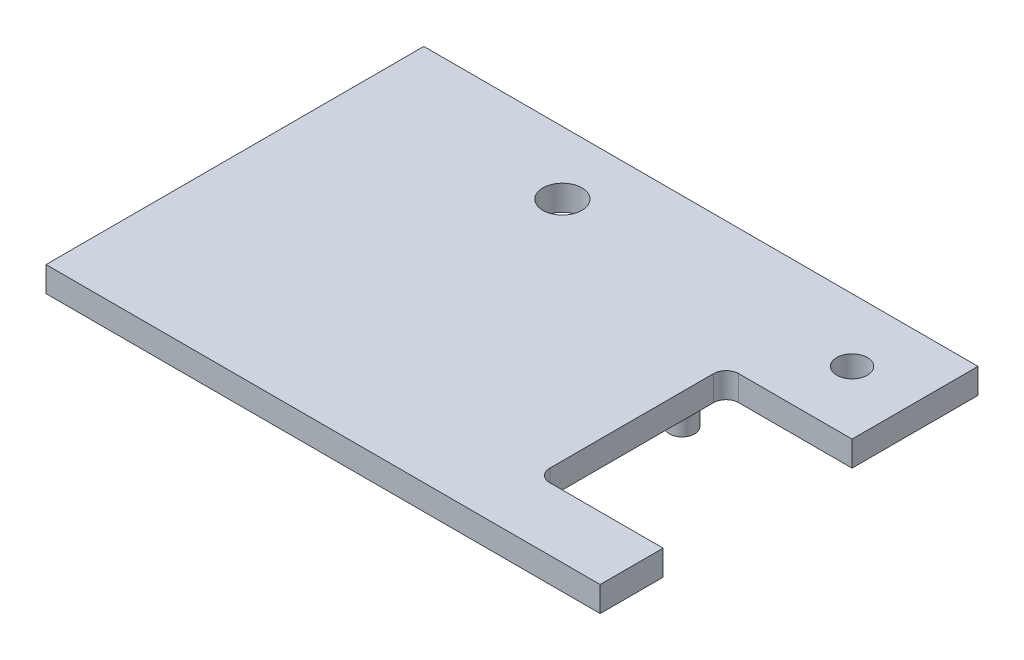
ISO-10303-21;
HEADER;
FILE_DESCRIPTION(('STEP AP214'),'2;1');
FILE_NAME('part.step','',(''),(''),'','','');
FILE_SCHEMA(('AUTOMOTIVE_DESIGN { 1 0 10303 214 1 1 1 1 }'));
ENDSEC;
DATA;
#1=APPLICATION_CONTEXT('core data for automotive mechanical design processes');
#2=APPLICATION_PROTOCOL_DEFINITION('international standard','automotive_design',2000,#1);
#3=PRODUCT_CONTEXT('',#1,'mechanical');
#4=PRODUCT('Part','Part','',(#3));
#5=PRODUCT_RELATED_PRODUCT_CATEGORY('part','',(#4));
#6=PRODUCT_DEFINITION_FORMATION('','',#4);
#7=PRODUCT_DEFINITION_CONTEXT('part definition',#1,'design');
#8=PRODUCT_DEFINITION('design','',#6,#7);
#9=PRODUCT_DEFINITION_SHAPE('','',#8);
#10=(LENGTH_UNIT() NAMED_UNIT(*) SI_UNIT(.MILLI.,.METRE.));
#11=(NAMED_UNIT(*) PLANE_ANGLE_UNIT() SI_UNIT($,.RADIAN.));
#12=(NAMED_UNIT(*) SI_UNIT($,.STERADIAN.) SOLID_ANGLE_UNIT());
#13=UNCERTAINTY_MEASURE_WITH_UNIT(LENGTH_MEASURE(1.E-05),#10,'distance_accuracy_value','');
#14=(GEOMETRIC_REPRESENTATION_CONTEXT(3) GLOBAL_UNCERTAINTY_ASSIGNED_CONTEXT((#13)) GLOBAL_UNIT_ASSIGNED_CONTEXT((#10,
#11,#12)) REPRESENTATION_CONTEXT('',''));
#15=CARTESIAN_POINT('',(0.,0.,0.));
#16=DIRECTION('',(0.,0.,1.));
#17=DIRECTION('',(1.,0.,0.));
#18=AXIS2_PLACEMENT_3D('',#15,#16,#17);
#19=CARTESIAN_POINT('',(22.,2.,15.));
#20=DIRECTION('',(-1.,0.,0.));
#21=DIRECTION('',(0.,0.,1.));
#22=AXIS2_PLACEMENT_3D('',#19,#20,#21);
#23=PLANE('',#22);
#24=DIRECTION('',(0.,0.,-1.));
#25=VECTOR('',#24,1.);
#26=CARTESIAN_POINT('',(22.,0.,15.));
#27=LINE('',#26,#25);
#28=CARTESIAN_POINT('',(22.,0.,15.));
#29=VERTEX_POINT('',#28);
#30=CARTESIAN_POINT('',(22.,0.,10.));
#31=VERTEX_POINT('',#30);
#32=EDGE_CURVE('E148',#29,#31,#27,.T.);
#33=ORIENTED_EDGE('',*,*,#32,.T.);
#34=DIRECTION('',(0.,1.,0.));
#35=VECTOR('',#34,1.);
#36=CARTESIAN_POINT('',(22.,2.,10.));
#37=LINE('',#36,#35);
#38=CARTESIAN_POINT('',(22.,2.,10.));
#39=VERTEX_POINT('',#38);
#40=EDGE_CURVE('E118',#31,#39,#37,.T.);
#41=ORIENTED_EDGE('',*,*,#40,.T.);
#42=DIRECTION('',(0.,0.,-1.));
#43=VECTOR('',#42,1.);
#44=CARTESIAN_POINT('',(22.,2.,15.));
#45=LINE('',#44,#43);
#46=CARTESIAN_POINT('',(22.,2.,15.));
#47=VERTEX_POINT('',#46);
#48=EDGE_CURVE('E132',#47,#39,#45,.T.);
#49=ORIENTED_EDGE('',*,*,#48,.F.);
#50=DIRECTION('',(0.,-1.,0.));
#51=VECTOR('',#50,1.);
#52=CARTESIAN_POINT('',(22.,2.,15.));
#53=LINE('',#52,#51);
#54=EDGE_CURVE('E147',#47,#29,#53,.T.);
#55=ORIENTED_EDGE('',*,*,#54,.T.);
#56=EDGE_LOOP('',(#33,#41,#49,#55));
#57=FACE_BOUND('',#56,.T.);
#58=ADVANCED_FACE('F37',(#57),#23,.F.);
#59=CARTESIAN_POINT('',(0.,2.,0.));
#60=DIRECTION('',(0.,-1.,0.));
#61=DIRECTION('',(0.,0.,-1.));
#62=AXIS2_PLACEMENT_3D('',#59,#60,#61);
#63=PLANE('',#62);
#64=ORIENTED_EDGE('',*,*,#48,.T.);
#65=DIRECTION('',(1.,0.,0.));
#66=VECTOR('',#65,1.);
#67=CARTESIAN_POINT('',(22.,2.,10.));
#68=LINE('',#67,#66);
#69=CARTESIAN_POINT('',(13.,2.,10.));
#70=VERTEX_POINT('',#69);
#71=EDGE_CURVE('E205',#70,#39,#68,.T.);
#72=ORIENTED_EDGE('',*,*,#71,.F.);
#73=CARTESIAN_POINT('',(13.,2.,9.));
#74=DIRECTION('',(0.,-1.,0.));
#75=DIRECTION('',(0.,0.,-1.));
#76=AXIS2_PLACEMENT_3D('',#73,#74,#75);
#77=CIRCLE('',#76,1.);
#78=CARTESIAN_POINT('',(12.,2.,9.00000000000001));
#79=VERTEX_POINT('',#78);
#80=EDGE_CURVE('E183',#70,#79,#77,.T.);
#81=ORIENTED_EDGE('',*,*,#80,.T.);
#82=DIRECTION('',(0.,0.,1.));
#83=VECTOR('',#82,1.);
#84=CARTESIAN_POINT('',(12.,2.,-5.));
#85=LINE('',#84,#83);
#86=CARTESIAN_POINT('',(12.,2.,-4.));
#87=VERTEX_POINT('',#86);
#88=EDGE_CURVE('E126',#87,#79,#85,.T.);
#89=ORIENTED_EDGE('',*,*,#88,.F.);
#90=CARTESIAN_POINT('',(13.,2.,-4.));
#91=DIRECTION('',(0.,-1.,0.));
#92=DIRECTION('',(0.,0.,-1.));
#93=AXIS2_PLACEMENT_3D('',#90,#91,#92);
#94=CIRCLE('',#93,1.);
#95=CARTESIAN_POINT('',(13.,2.,-5.));
#96=VERTEX_POINT('',#95);
#97=EDGE_CURVE('E45',#87,#96,#94,.T.);
#98=ORIENTED_EDGE('',*,*,#97,.T.);
#99=DIRECTION('',(-1.,0.,0.));
#100=VECTOR('',#99,1.);
#101=CARTESIAN_POINT('',(22.,2.,-5.));
#102=LINE('',#101,#100);
#103=CARTESIAN_POINT('',(22.,2.,-5.));
#104=VERTEX_POINT('',#103);
#105=EDGE_CURVE('E113',#104,#96,#102,.T.);
#106=ORIENTED_EDGE('',*,*,#105,.F.);
#107=CARTESIAN_POINT('',(22.,2.,-15.));
#108=VERTEX_POINT('',#107);
#109=EDGE_CURVE('E124',#104,#108,#45,.T.);
#110=ORIENTED_EDGE('',*,*,#109,.T.);
#111=DIRECTION('',(-1.,0.,0.));
#112=VECTOR('',#111,1.);
#113=CARTESIAN_POINT('',(-22.,2.,-15.));
#114=LINE('',#113,#112);
#115=CARTESIAN_POINT('',(-22.,2.,-15.));
#116=VERTEX_POINT('',#115);
#117=EDGE_CURVE('E135',#108,#116,#114,.T.);
#118=ORIENTED_EDGE('',*,*,#117,.T.);
#119=DIRECTION('',(0.,0.,1.));
#120=VECTOR('',#119,1.);
#121=CARTESIAN_POINT('',(-22.,2.,15.));
#122=LINE('',#121,#120);
#123=CARTESIAN_POINT('',(-22.,2.,15.));
#124=VERTEX_POINT('',#123);
#125=EDGE_CURVE('E143',#116,#124,#122,.T.);
#126=ORIENTED_EDGE('',*,*,#125,.T.);
#127=DIRECTION('',(1.,0.,0.));
#128=VECTOR('',#127,1.);
#129=CARTESIAN_POINT('',(-22.,2.,15.));
#130=LINE('',#129,#128);
#131=EDGE_CURVE('E145',#124,#47,#130,.T.);
#132=ORIENTED_EDGE('',*,*,#131,.T.);
#133=EDGE_LOOP('',(#64,#72,#81,#89,#98,#106,#110,#118,#126,#132));
#134=FACE_BOUND('',#133,.T.);
#135=CARTESIAN_POINT('',(17.,2.,-10.));
#136=DIRECTION('',(0.,1.,0.));
#137=DIRECTION('',(0.,0.,1.));
#138=AXIS2_PLACEMENT_3D('',#135,#136,#137);
#139=CIRCLE('',#138,1.2192);
#140=CARTESIAN_POINT('',(17.,2.,-8.7808));
#141=VERTEX_POINT('',#140);
#142=EDGE_CURVE('E241',#141,#141,#139,.T.);
#143=ORIENTED_EDGE('',*,*,#142,.F.);
#144=EDGE_LOOP('',(#143));
#145=FACE_BOUND('',#144,.T.);
#146=CARTESIAN_POINT('',(-6.00000000000001,2.,-10.));
#147=DIRECTION('',(0.,1.,0.));
#148=DIRECTION('',(0.,0.,1.));
#149=AXIS2_PLACEMENT_3D('',#146,#147,#148);
#150=CIRCLE('',#149,1.55);
#151=CARTESIAN_POINT('',(-6.00000000000001,2.,-8.45));
#152=VERTEX_POINT('',#151);
#153=EDGE_CURVE('E237',#152,#152,#150,.T.);
#154=ORIENTED_EDGE('',*,*,#153,.F.);
#155=EDGE_LOOP('',(#154));
#156=FACE_BOUND('',#155,.T.);
#157=ADVANCED_FACE('F122',(#134,#145,#156),#63,.F.);
#158=CARTESIAN_POINT('',(0.,0.,0.));
#159=DIRECTION('',(0.,-1.,0.));
#160=DIRECTION('',(0.,0.,-1.));
#161=AXIS2_PLACEMENT_3D('',#158,#159,#160);
#162=PLANE('',#161);
#163=DIRECTION('',(-1.,0.,0.));
#164=VECTOR('',#163,1.);
#165=CARTESIAN_POINT('',(0.,0.,10.));
#166=LINE('',#165,#164);
#167=CARTESIAN_POINT('',(13.,0.,10.));
#168=VERTEX_POINT('',#167);
#169=EDGE_CURVE('E194',#31,#168,#166,.T.);
#170=ORIENTED_EDGE('',*,*,#169,.F.);
#171=ORIENTED_EDGE('',*,*,#32,.F.);
#172=DIRECTION('',(1.,0.,0.));
#173=VECTOR('',#172,1.);
#174=CARTESIAN_POINT('',(-22.,0.,15.));
#175=LINE('',#174,#173);
#176=CARTESIAN_POINT('',(-22.,0.,15.));
#177=VERTEX_POINT('',#176);
#178=EDGE_CURVE('E133',#177,#29,#175,.T.);
#179=ORIENTED_EDGE('',*,*,#178,.F.);
#180=DIRECTION('',(0.,0.,1.));
#181=VECTOR('',#180,1.);
#182=CARTESIAN_POINT('',(-22.,0.,15.));
#183=LINE('',#182,#181);
#184=CARTESIAN_POINT('',(-22.,0.,-15.));
#185=VERTEX_POINT('',#184);
#186=EDGE_CURVE('E136',#185,#177,#183,.T.);
#187=ORIENTED_EDGE('',*,*,#186,.F.);
#188=DIRECTION('',(-1.,0.,0.));
#189=VECTOR('',#188,1.);
#190=CARTESIAN_POINT('',(-22.,0.,-15.));
#191=LINE('',#190,#189);
#192=CARTESIAN_POINT('',(22.,0.,-15.));
#193=VERTEX_POINT('',#192);
#194=EDGE_CURVE('E151',#193,#185,#191,.T.);
#195=ORIENTED_EDGE('',*,*,#194,.F.);
#196=CARTESIAN_POINT('',(22.,0.,-5.));
#197=VERTEX_POINT('',#196);
#198=EDGE_CURVE('E152',#197,#193,#27,.T.);
#199=ORIENTED_EDGE('',*,*,#198,.F.);
#200=DIRECTION('',(1.,0.,0.));
#201=VECTOR('',#200,1.);
#202=CARTESIAN_POINT('',(0.,0.,-5.));
#203=LINE('',#202,#201);
#204=CARTESIAN_POINT('',(13.,0.,-5.));
#205=VERTEX_POINT('',#204);
#206=EDGE_CURVE('E114',#205,#197,#203,.T.);
#207=ORIENTED_EDGE('',*,*,#206,.F.);
#208=CARTESIAN_POINT('',(13.,0.,-4.));
#209=DIRECTION('',(0.,-1.,0.));
#210=DIRECTION('',(0.,0.,-1.));
#211=AXIS2_PLACEMENT_3D('',#208,#209,#210);
#212=CIRCLE('',#211,1.);
#213=CARTESIAN_POINT('',(12.,0.,-4.));
#214=VERTEX_POINT('',#213);
#215=EDGE_CURVE('E11',#205,#214,#212,.F.);
#216=ORIENTED_EDGE('',*,*,#215,.T.);
#217=DIRECTION('',(0.,0.,-1.));
#218=VECTOR('',#217,1.);
#219=CARTESIAN_POINT('',(12.,0.,0.));
#220=LINE('',#219,#218);
#221=CARTESIAN_POINT('',(12.,0.,9.));
#222=VERTEX_POINT('',#221);
#223=EDGE_CURVE('E171',#222,#214,#220,.T.);
#224=ORIENTED_EDGE('',*,*,#223,.F.);
#225=CARTESIAN_POINT('',(13.,0.,9.));
#226=DIRECTION('',(0.,-1.,0.));
#227=DIRECTION('',(0.,0.,-1.));
#228=AXIS2_PLACEMENT_3D('',#225,#226,#227);
#229=CIRCLE('',#228,1.);
#230=EDGE_CURVE('E185',#222,#168,#229,.F.);
#231=ORIENTED_EDGE('',*,*,#230,.T.);
#232=EDGE_LOOP('',(#170,#171,#179,#187,#195,#199,#207,#216,#224,#231));
#233=FACE_BOUND('',#232,.T.);
#234=CARTESIAN_POINT('',(9.99999999999999,0.,-3.5));
#235=DIRECTION('',(0.,-1.,0.));
#236=DIRECTION('',(0.,0.,-1.));
#237=AXIS2_PLACEMENT_3D('',#234,#235,#236);
#238=CIRCLE('',#237,1.);
#239=CARTESIAN_POINT('',(9.99999999999999,0.,-4.5));
#240=VERTEX_POINT('',#239);
#241=EDGE_CURVE('E213',#240,#240,#238,.T.);
#242=ORIENTED_EDGE('',*,*,#241,.F.);
#243=EDGE_LOOP('',(#242));
#244=FACE_BOUND('',#243,.T.);
#245=CARTESIAN_POINT('',(-18.5,0.,-3.5));
#246=DIRECTION('',(0.,-1.,0.));
#247=DIRECTION('',(0.,0.,-1.));
#248=AXIS2_PLACEMENT_3D('',#245,#246,#247);
#249=CIRCLE('',#248,1.);
#250=CARTESIAN_POINT('',(-18.5,0.,-4.5));
#251=VERTEX_POINT('',#250);
#252=EDGE_CURVE('E219',#251,#251,#249,.T.);
#253=ORIENTED_EDGE('',*,*,#252,.F.);
#254=EDGE_LOOP('',(#253));
#255=FACE_BOUND('',#254,.T.);
#256=CARTESIAN_POINT('',(10.,0.,8.5));
#257=DIRECTION('',(0.,-1.,0.));
#258=DIRECTION('',(0.,0.,-1.));
#259=AXIS2_PLACEMENT_3D('',#256,#257,#258);
#260=CIRCLE('',#259,1.);
#261=CARTESIAN_POINT('',(10.,0.,7.5));
#262=VERTEX_POINT('',#261);
#263=EDGE_CURVE('E222',#262,#262,#260,.T.);
#264=ORIENTED_EDGE('',*,*,#263,.F.);
#265=EDGE_LOOP('',(#264));
#266=FACE_BOUND('',#265,.T.);
#267=CARTESIAN_POINT('',(9.99999999999999,0.,12.5));
#268=DIRECTION('',(0.,-1.,0.));
#269=DIRECTION('',(0.,0.,-1.));
#270=AXIS2_PLACEMENT_3D('',#267,#268,#269);
#271=CIRCLE('',#270,1.);
#272=CARTESIAN_POINT('',(9.99999999999999,0.,11.5));
#273=VERTEX_POINT('',#272);
#274=EDGE_CURVE('E228',#273,#273,#271,.T.);
#275=ORIENTED_EDGE('',*,*,#274,.F.);
#276=EDGE_LOOP('',(#275));
#277=FACE_BOUND('',#276,.T.);
#278=CARTESIAN_POINT('',(-19.,0.,-12.));
#279=DIRECTION('',(0.,-1.,0.));
#280=DIRECTION('',(0.,0.,-1.));
#281=AXIS2_PLACEMENT_3D('',#278,#279,#280);
#282=CIRCLE('',#281,1.);
#283=CARTESIAN_POINT('',(-19.,0.,-13.));
#284=VERTEX_POINT('',#283);
#285=EDGE_CURVE('E233',#284,#284,#282,.T.);
#286=ORIENTED_EDGE('',*,*,#285,.F.);
#287=EDGE_LOOP('',(#286));
#288=FACE_BOUND('',#287,.T.);
#289=CARTESIAN_POINT('',(17.,0.,-10.));
#290=DIRECTION('',(0.,1.,0.));
#291=DIRECTION('',(0.,0.,1.));
#292=AXIS2_PLACEMENT_3D('',#289,#290,#291);
#293=CIRCLE('',#292,1.2192);
#294=CARTESIAN_POINT('',(17.,0.,-8.7808));
#295=VERTEX_POINT('',#294);
#296=EDGE_CURVE('E140',#295,#295,#293,.T.);
#297=ORIENTED_EDGE('',*,*,#296,.T.);
#298=EDGE_LOOP('',(#297));
#299=FACE_BOUND('',#298,.T.);
#300=CARTESIAN_POINT('',(-6.00000000000001,0.,-10.));
#301=DIRECTION('',(0.,1.,0.));
#302=DIRECTION('',(0.,0.,1.));
#303=AXIS2_PLACEMENT_3D('',#300,#301,#302);
#304=CIRCLE('',#303,1.55);
#305=CARTESIAN_POINT('',(-6.00000000000001,0.,-8.45));
#306=VERTEX_POINT('',#305);
#307=EDGE_CURVE('E236',#306,#306,#304,.T.);
#308=ORIENTED_EDGE('',*,*,#307,.T.);
#309=EDGE_LOOP('',(#308));
#310=FACE_BOUND('',#309,.T.);
#311=ADVANCED_FACE('F191',(#233,#244,#255,#266,#277,#288,#299,#310),#162,.T.);
#312=ORIENTED_EDGE('',*,*,#109,.F.);
#313=DIRECTION('',(0.,-1.,0.));
#314=VECTOR('',#313,1.);
#315=CARTESIAN_POINT('',(22.,2.,-5.));
#316=LINE('',#315,#314);
#317=EDGE_CURVE('E111',#104,#197,#316,.T.);
#318=ORIENTED_EDGE('',*,*,#317,.T.);
#319=ORIENTED_EDGE('',*,*,#198,.T.);
#320=DIRECTION('',(0.,-1.,0.));
#321=VECTOR('',#320,1.);
#322=CARTESIAN_POINT('',(22.,2.,-15.));
#323=LINE('',#322,#321);
#324=EDGE_CURVE('E131',#108,#193,#323,.T.);
#325=ORIENTED_EDGE('',*,*,#324,.F.);
#326=EDGE_LOOP('',(#312,#318,#319,#325));
#327=FACE_BOUND('',#326,.T.);
#328=ADVANCED_FACE('F129',(#327),#23,.F.);
#329=CARTESIAN_POINT('',(-22.,2.,-15.));
#330=DIRECTION('',(0.,0.,1.));
#331=DIRECTION('',(1.,0.,0.));
#332=AXIS2_PLACEMENT_3D('',#329,#330,#331);
#333=PLANE('',#332);
#334=ORIENTED_EDGE('',*,*,#194,.T.);
#335=DIRECTION('',(0.,-1.,0.));
#336=VECTOR('',#335,1.);
#337=CARTESIAN_POINT('',(-22.,2.,-15.));
#338=LINE('',#337,#336);
#339=EDGE_CURVE('E160',#116,#185,#338,.T.);
#340=ORIENTED_EDGE('',*,*,#339,.F.);
#341=ORIENTED_EDGE('',*,*,#117,.F.);
#342=ORIENTED_EDGE('',*,*,#324,.T.);
#343=EDGE_LOOP('',(#334,#340,#341,#342));
#344=FACE_BOUND('',#343,.T.);
#345=ADVANCED_FACE('F276',(#344),#333,.F.);
#346=CARTESIAN_POINT('',(-22.,2.,15.));
#347=DIRECTION('',(1.,0.,0.));
#348=DIRECTION('',(0.,0.,-1.));
#349=AXIS2_PLACEMENT_3D('',#346,#347,#348);
#350=PLANE('',#349);
#351=ORIENTED_EDGE('',*,*,#186,.T.);
#352=DIRECTION('',(0.,-1.,0.));
#353=VECTOR('',#352,1.);
#354=CARTESIAN_POINT('',(-22.,2.,15.));
#355=LINE('',#354,#353);
#356=EDGE_CURVE('E157',#124,#177,#355,.T.);
#357=ORIENTED_EDGE('',*,*,#356,.F.);
#358=ORIENTED_EDGE('',*,*,#125,.F.);
#359=ORIENTED_EDGE('',*,*,#339,.T.);
#360=EDGE_LOOP('',(#351,#357,#358,#359));
#361=FACE_BOUND('',#360,.T.);
#362=ADVANCED_FACE('F262',(#361),#350,.F.);
#363=CARTESIAN_POINT('',(-22.,2.,15.));
#364=DIRECTION('',(0.,0.,-1.));
#365=DIRECTION('',(-1.,0.,0.));
#366=AXIS2_PLACEMENT_3D('',#363,#364,#365);
#367=PLANE('',#366);
#368=ORIENTED_EDGE('',*,*,#178,.T.);
#369=ORIENTED_EDGE('',*,*,#54,.F.);
#370=ORIENTED_EDGE('',*,*,#131,.F.);
#371=ORIENTED_EDGE('',*,*,#356,.T.);
#372=EDGE_LOOP('',(#368,#369,#370,#371));
#373=FACE_BOUND('',#372,.T.);
#374=ADVANCED_FACE('F253',(#373),#367,.F.);
#375=CARTESIAN_POINT('',(17.,2.,-10.));
#376=DIRECTION('',(0.,-1.,0.));
#377=DIRECTION('',(0.,0.,-1.));
#378=AXIS2_PLACEMENT_3D('',#375,#376,#377);
#379=CYLINDRICAL_SURFACE('',#378,1.2192);
#380=ORIENTED_EDGE('',*,*,#142,.T.);
#381=EDGE_LOOP('',(#380));
#382=FACE_BOUND('',#381,.T.);
#383=ORIENTED_EDGE('',*,*,#296,.F.);
#384=EDGE_LOOP('',(#383));
#385=FACE_BOUND('',#384,.T.);
#386=ADVANCED_FACE('F250',(#382,#385),#379,.F.);
#387=CARTESIAN_POINT('',(-6.00000000000001,2.,-10.));
#388=DIRECTION('',(0.,-1.,0.));
#389=DIRECTION('',(0.,0.,-1.));
#390=AXIS2_PLACEMENT_3D('',#387,#388,#389);
#391=CYLINDRICAL_SURFACE('',#390,1.55);
#392=ORIENTED_EDGE('',*,*,#153,.T.);
#393=EDGE_LOOP('',(#392));
#394=FACE_BOUND('',#393,.T.);
#395=ORIENTED_EDGE('',*,*,#307,.F.);
#396=EDGE_LOOP('',(#395));
#397=FACE_BOUND('',#396,.T.);
#398=ADVANCED_FACE('F252',(#394,#397),#391,.F.);
#399=CARTESIAN_POINT('',(-19.,-1.5,-12.));
#400=DIRECTION('',(0.,1.,0.));
#401=DIRECTION('',(0.,0.,1.));
#402=AXIS2_PLACEMENT_3D('',#399,#400,#401);
#403=CYLINDRICAL_SURFACE('',#402,1.);
#404=CARTESIAN_POINT('',(-19.,-0.5,-12.));
#405=DIRECTION('',(0.,1.,0.));
#406=DIRECTION('',(0.,0.,1.));
#407=AXIS2_PLACEMENT_3D('',#404,#405,#406);
#408=CIRCLE('',#407,1.);
#409=CARTESIAN_POINT('',(-19.,-0.5,-11.));
#410=VERTEX_POINT('',#409);
#411=EDGE_CURVE('E119',#410,#410,#408,.T.);
#412=ORIENTED_EDGE('',*,*,#411,.T.);
#413=EDGE_LOOP('',(#412));
#414=FACE_BOUND('',#413,.T.);
#415=ORIENTED_EDGE('',*,*,#285,.T.);
#416=EDGE_LOOP('',(#415));
#417=FACE_BOUND('',#416,.T.);
#418=ADVANCED_FACE('F259',(#414,#417),#403,.T.);
#419=CARTESIAN_POINT('',(9.99999999999999,-1.5,12.5));
#420=DIRECTION('',(0.,1.,0.));
#421=DIRECTION('',(0.,0.,1.));
#422=AXIS2_PLACEMENT_3D('',#419,#420,#421);
#423=CYLINDRICAL_SURFACE('',#422,1.);
#424=CARTESIAN_POINT('',(9.99999999999999,-0.5,12.5));
#425=DIRECTION('',(0.,1.,0.));
#426=DIRECTION('',(0.,0.,1.));
#427=AXIS2_PLACEMENT_3D('',#424,#425,#426);
#428=CIRCLE('',#427,1.);
#429=CARTESIAN_POINT('',(9.99999999999999,-0.5,13.5));
#430=VERTEX_POINT('',#429);
#431=EDGE_CURVE('E164',#430,#430,#428,.T.);
#432=ORIENTED_EDGE('',*,*,#431,.T.);
#433=EDGE_LOOP('',(#432));
#434=FACE_BOUND('',#433,.T.);
#435=ORIENTED_EDGE('',*,*,#274,.T.);
#436=EDGE_LOOP('',(#435));
#437=FACE_BOUND('',#436,.T.);
#438=ADVANCED_FACE('F317',(#434,#437),#423,.T.);
#439=CARTESIAN_POINT('',(9.99999999999999,-0.5,12.5));
#440=DIRECTION('',(0.,-1.,0.));
#441=DIRECTION('',(0.,0.,-1.));
#442=AXIS2_PLACEMENT_3D('',#439,#440,#441);
#443=SPHERICAL_SURFACE('',#442,1.);
#444=ORIENTED_EDGE('',*,*,#431,.F.);
#445=EDGE_LOOP('',(#444));
#446=FACE_BOUND('',#445,.T.);
#447=ADVANCED_FACE('F314',(#446),#443,.T.);
#448=CARTESIAN_POINT('',(-19.,-0.5,-12.));
#449=DIRECTION('',(0.,-1.,0.));
#450=DIRECTION('',(0.,0.,-1.));
#451=AXIS2_PLACEMENT_3D('',#448,#449,#450);
#452=SPHERICAL_SURFACE('',#451,1.);
#453=ORIENTED_EDGE('',*,*,#411,.F.);
#454=EDGE_LOOP('',(#453));
#455=FACE_BOUND('',#454,.T.);
#456=ADVANCED_FACE('F311',(#455),#452,.T.);
#457=CARTESIAN_POINT('',(10.,-2.4,8.5));
#458=DIRECTION('',(0.,1.,0.));
#459=DIRECTION('',(0.,0.,1.));
#460=AXIS2_PLACEMENT_3D('',#457,#458,#459);
#461=CYLINDRICAL_SURFACE('',#460,1.);
#462=CARTESIAN_POINT('',(10.,-2.4,8.5));
#463=DIRECTION('',(0.,-1.,0.));
#464=DIRECTION('',(0.,0.,-1.));
#465=AXIS2_PLACEMENT_3D('',#462,#463,#464);
#466=CIRCLE('',#465,1.);
#467=CARTESIAN_POINT('',(10.,-2.4,7.5));
#468=VERTEX_POINT('',#467);
#469=EDGE_CURVE('E225',#468,#468,#466,.T.);
#470=ORIENTED_EDGE('',*,*,#469,.F.);
#471=EDGE_LOOP('',(#470));
#472=FACE_BOUND('',#471,.T.);
#473=ORIENTED_EDGE('',*,*,#263,.T.);
#474=EDGE_LOOP('',(#473));
#475=FACE_BOUND('',#474,.T.);
#476=ADVANCED_FACE('F313',(#472,#475),#461,.T.);
#477=CARTESIAN_POINT('',(0.,-2.4,0.));
#478=DIRECTION('',(0.,-1.,0.));
#479=DIRECTION('',(0.,0.,-1.));
#480=AXIS2_PLACEMENT_3D('',#477,#478,#479);
#481=PLANE('',#480);
#482=ORIENTED_EDGE('',*,*,#469,.T.);
#483=EDGE_LOOP('',(#482));
#484=FACE_BOUND('',#483,.T.);
#485=ADVANCED_FACE('F339',(#484),#481,.T.);
#486=CARTESIAN_POINT('',(-18.5,-2.4,-3.5));
#487=DIRECTION('',(0.,1.,0.));
#488=DIRECTION('',(0.,0.,1.));
#489=AXIS2_PLACEMENT_3D('',#486,#487,#488);
#490=CYLINDRICAL_SURFACE('',#489,1.);
#491=CARTESIAN_POINT('',(-18.5,-2.4,-3.5));
#492=DIRECTION('',(0.,-1.,0.));
#493=DIRECTION('',(0.,0.,-1.));
#494=AXIS2_PLACEMENT_3D('',#491,#492,#493);
#495=CIRCLE('',#494,1.);
#496=CARTESIAN_POINT('',(-18.5,-2.4,-4.5));
#497=VERTEX_POINT('',#496);
#498=EDGE_CURVE('E216',#497,#497,#495,.T.);
#499=ORIENTED_EDGE('',*,*,#498,.F.);
#500=EDGE_LOOP('',(#499));
#501=FACE_BOUND('',#500,.T.);
#502=ORIENTED_EDGE('',*,*,#252,.T.);
#503=EDGE_LOOP('',(#502));
#504=FACE_BOUND('',#503,.T.);
#505=ADVANCED_FACE('F343',(#501,#504),#490,.T.);
#506=CARTESIAN_POINT('',(0.,-2.4,0.));
#507=DIRECTION('',(0.,-1.,0.));
#508=DIRECTION('',(0.,0.,-1.));
#509=AXIS2_PLACEMENT_3D('',#506,#507,#508);
#510=PLANE('',#509);
#511=ORIENTED_EDGE('',*,*,#498,.T.);
#512=EDGE_LOOP('',(#511));
#513=FACE_BOUND('',#512,.T.);
#514=ADVANCED_FACE('F345',(#513),#510,.T.);
#515=CARTESIAN_POINT('',(9.99999999999999,-2.4,-3.5));
#516=DIRECTION('',(0.,1.,0.));
#517=DIRECTION('',(0.,0.,1.));
#518=AXIS2_PLACEMENT_3D('',#515,#516,#517);
#519=CYLINDRICAL_SURFACE('',#518,1.);
#520=CARTESIAN_POINT('',(9.99999999999999,-2.4,-3.5));
#521=DIRECTION('',(0.,-1.,0.));
#522=DIRECTION('',(0.,0.,-1.));
#523=AXIS2_PLACEMENT_3D('',#520,#521,#522);
#524=CIRCLE('',#523,1.);
#525=CARTESIAN_POINT('',(9.99999999999999,-2.4,-4.5));
#526=VERTEX_POINT('',#525);
#527=EDGE_CURVE('E201',#526,#526,#524,.T.);
#528=ORIENTED_EDGE('',*,*,#527,.F.);
#529=EDGE_LOOP('',(#528));
#530=FACE_BOUND('',#529,.T.);
#531=ORIENTED_EDGE('',*,*,#241,.T.);
#532=EDGE_LOOP('',(#531));
#533=FACE_BOUND('',#532,.T.);
#534=ADVANCED_FACE('F348',(#530,#533),#519,.T.);
#535=CARTESIAN_POINT('',(9.99999999999999,-2.4,-3.5));
#536=DIRECTION('',(0.,-1.,0.));
#537=DIRECTION('',(0.,0.,-1.));
#538=AXIS2_PLACEMENT_3D('',#535,#536,#537);
#539=PLANE('',#538);
#540=ORIENTED_EDGE('',*,*,#527,.T.);
#541=EDGE_LOOP('',(#540));
#542=FACE_BOUND('',#541,.T.);
#543=ADVANCED_FACE('F353',(#542),#539,.T.);
#544=CARTESIAN_POINT('',(22.,-2.4,10.));
#545=DIRECTION('',(0.,0.,1.));
#546=DIRECTION('',(1.,0.,0.));
#547=AXIS2_PLACEMENT_3D('',#544,#545,#546);
#548=PLANE('',#547);
#549=ORIENTED_EDGE('',*,*,#169,.T.);
#550=DIRECTION('',(0.,1.,0.));
#551=VECTOR('',#550,1.);
#552=CARTESIAN_POINT('',(13.,2.,10.));
#553=LINE('',#552,#551);
#554=EDGE_CURVE('E174',#168,#70,#553,.T.);
#555=ORIENTED_EDGE('',*,*,#554,.T.);
#556=ORIENTED_EDGE('',*,*,#71,.T.);
#557=ORIENTED_EDGE('',*,*,#40,.F.);
#558=EDGE_LOOP('',(#549,#555,#556,#557));
#559=FACE_BOUND('',#558,.T.);
#560=ADVANCED_FACE('F199',(#559),#548,.F.);
#561=CARTESIAN_POINT('',(12.,-2.4,-5.));
#562=DIRECTION('',(-1.,0.,0.));
#563=DIRECTION('',(0.,0.,1.));
#564=AXIS2_PLACEMENT_3D('',#561,#562,#563);
#565=PLANE('',#564);
#566=ORIENTED_EDGE('',*,*,#88,.T.);
#567=DIRECTION('',(0.,1.,0.));
#568=VECTOR('',#567,1.);
#569=CARTESIAN_POINT('',(12.,0.,9.));
#570=LINE('',#569,#568);
#571=EDGE_CURVE('E180',#79,#222,#570,.F.);
#572=ORIENTED_EDGE('',*,*,#571,.T.);
#573=ORIENTED_EDGE('',*,*,#223,.T.);
#574=DIRECTION('',(0.,1.,0.));
#575=VECTOR('',#574,1.);
#576=CARTESIAN_POINT('',(12.,2.,-4.));
#577=LINE('',#576,#575);
#578=EDGE_CURVE('E177',#214,#87,#577,.T.);
#579=ORIENTED_EDGE('',*,*,#578,.T.);
#580=EDGE_LOOP('',(#566,#572,#573,#579));
#581=FACE_BOUND('',#580,.T.);
#582=ADVANCED_FACE('F207',(#581),#565,.F.);
#583=CARTESIAN_POINT('',(22.,-2.4,-5.));
#584=DIRECTION('',(0.,0.,-1.));
#585=DIRECTION('',(-1.,0.,0.));
#586=AXIS2_PLACEMENT_3D('',#583,#584,#585);
#587=PLANE('',#586);
#588=ORIENTED_EDGE('',*,*,#105,.T.);
#589=DIRECTION('',(0.,1.,0.));
#590=VECTOR('',#589,1.);
#591=CARTESIAN_POINT('',(13.,0.,-5.));
#592=LINE('',#591,#590);
#593=EDGE_CURVE('E58',#96,#205,#592,.F.);
#594=ORIENTED_EDGE('',*,*,#593,.T.);
#595=ORIENTED_EDGE('',*,*,#206,.T.);
#596=ORIENTED_EDGE('',*,*,#317,.F.);
#597=EDGE_LOOP('',(#588,#594,#595,#596));
#598=FACE_BOUND('',#597,.T.);
#599=ADVANCED_FACE('F112',(#598),#587,.F.);
#600=CARTESIAN_POINT('',(13.,-2.4,9.));
#601=DIRECTION('',(0.,-1.,0.));
#602=DIRECTION('',(0.,0.,-1.));
#603=AXIS2_PLACEMENT_3D('',#600,#601,#602);
#604=CYLINDRICAL_SURFACE('',#603,1.);
#605=ORIENTED_EDGE('',*,*,#230,.F.);
#606=ORIENTED_EDGE('',*,*,#571,.F.);
#607=ORIENTED_EDGE('',*,*,#80,.F.);
#608=ORIENTED_EDGE('',*,*,#554,.F.);
#609=EDGE_LOOP('',(#605,#606,#607,#608));
#610=FACE_BOUND('',#609,.T.);
#611=ADVANCED_FACE('F203',(#610),#604,.F.);
#612=CARTESIAN_POINT('',(13.,-2.4,-4.));
#613=DIRECTION('',(0.,-1.,0.));
#614=DIRECTION('',(0.,0.,-1.));
#615=AXIS2_PLACEMENT_3D('',#612,#613,#614);
#616=CYLINDRICAL_SURFACE('',#615,1.);
#617=ORIENTED_EDGE('',*,*,#215,.F.);
#618=ORIENTED_EDGE('',*,*,#593,.F.);
#619=ORIENTED_EDGE('',*,*,#97,.F.);
#620=ORIENTED_EDGE('',*,*,#578,.F.);
#621=EDGE_LOOP('',(#617,#618,#619,#620));
#622=FACE_BOUND('',#621,.T.);
#623=ADVANCED_FACE('F39',(#622),#616,.F.);
#624=CLOSED_SHELL('',(#58,#157,#311,#328,#345,#362,#374,#386,#398,#418,#438,#447,#456,#476,#485,
#505,#514,#534,#543,#560,#582,#599,#611,#623));
#625=MANIFOLD_SOLID_BREP('B2',#624);
#626=ADVANCED_BREP_SHAPE_REPRESENTATION('',(#18,#625),#14);
#627=SHAPE_DEFINITION_REPRESENTATION(#9,#626);
ENDSEC;
END-ISO-10303-21;
